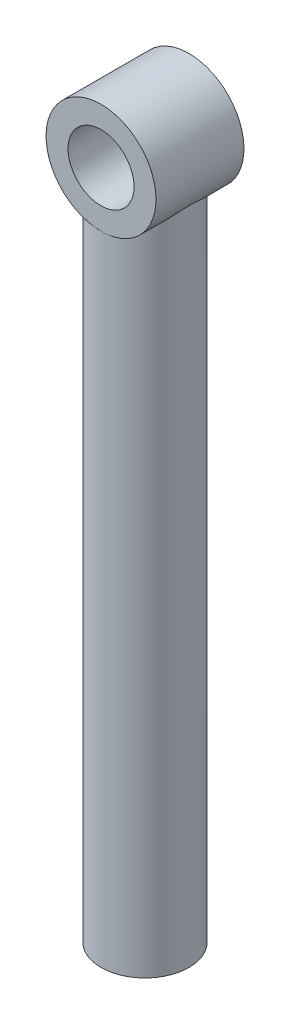
ISO-10303-21;
HEADER;
FILE_DESCRIPTION(('STEP AP214'),'2;1');
FILE_NAME('part.step','',(''),(''),'','','');
FILE_SCHEMA(('AUTOMOTIVE_DESIGN { 1 0 10303 214 1 1 1 1 }'));
ENDSEC;
DATA;
#1=APPLICATION_CONTEXT('core data for automotive mechanical design processes');
#2=APPLICATION_PROTOCOL_DEFINITION('international standard','automotive_design',2000,#1);
#3=PRODUCT_CONTEXT('',#1,'mechanical');
#4=PRODUCT('Part','Part','',(#3));
#5=PRODUCT_RELATED_PRODUCT_CATEGORY('part','',(#4));
#6=PRODUCT_DEFINITION_FORMATION('','',#4);
#7=PRODUCT_DEFINITION_CONTEXT('part definition',#1,'design');
#8=PRODUCT_DEFINITION('design','',#6,#7);
#9=PRODUCT_DEFINITION_SHAPE('','',#8);
#10=(LENGTH_UNIT() NAMED_UNIT(*) SI_UNIT(.MILLI.,.METRE.));
#11=(NAMED_UNIT(*) PLANE_ANGLE_UNIT() SI_UNIT($,.RADIAN.));
#12=(NAMED_UNIT(*) SI_UNIT($,.STERADIAN.) SOLID_ANGLE_UNIT());
#13=UNCERTAINTY_MEASURE_WITH_UNIT(LENGTH_MEASURE(1.E-05),#10,'distance_accuracy_value','');
#14=(GEOMETRIC_REPRESENTATION_CONTEXT(3) GLOBAL_UNCERTAINTY_ASSIGNED_CONTEXT((#13)) GLOBAL_UNIT_ASSIGNED_CONTEXT((#10,
#11,#12)) REPRESENTATION_CONTEXT('',''));
#15=CARTESIAN_POINT('',(0.,0.,0.));
#16=DIRECTION('',(0.,0.,1.));
#17=DIRECTION('',(1.,0.,0.));
#18=AXIS2_PLACEMENT_3D('',#15,#16,#17);
#19=CARTESIAN_POINT('',(0.,82.5,10.));
#20=DIRECTION('',(0.,0.,-1.));
#21=DIRECTION('',(-1.,0.,0.));
#22=AXIS2_PLACEMENT_3D('',#19,#20,#21);
#23=CYLINDRICAL_SURFACE('',#22,12.5);
#24=CARTESIAN_POINT('',(0.,82.5,10.));
#25=DIRECTION('',(0.,0.,1.));
#26=DIRECTION('',(1.,0.,0.));
#27=AXIS2_PLACEMENT_3D('',#24,#25,#26);
#28=CIRCLE('',#27,12.5);
#29=CARTESIAN_POINT('',(0.,70.,10.));
#30=VERTEX_POINT('',#29);
#31=EDGE_CURVE('E69',#30,#30,#28,.T.);
#32=ORIENTED_EDGE('',*,*,#31,.F.);
#33=CARTESIAN_POINT('',(-10.,75.,0.));
#34=CARTESIAN_POINT('',(-9.99999813174554,74.9999955448346,0.187780747230337));
#35=CARTESIAN_POINT('',(-9.99469639941468,74.9929123550896,0.375630167192678));
#36=CARTESIAN_POINT('',(-9.97361488371543,74.964928738387,0.74977845077353));
#37=CARTESIAN_POINT('',(-9.95782795537293,74.9440188895099,0.936076169296165));
#38=CARTESIAN_POINT('',(-9.91608860558737,74.8893255630799,1.30611935614103));
#39=CARTESIAN_POINT('',(-9.89010888419241,74.8555075194093,1.48985658649809));
#40=CARTESIAN_POINT('',(-9.82850531757991,74.7764654770198,1.85323389715609));
#41=CARTESIAN_POINT('',(-9.79287806515198,74.731237449033,2.03287250560135));
#42=CARTESIAN_POINT('',(-9.69856322438723,74.6135969548662,2.44905976839817));
#43=CARTESIAN_POINT('',(-9.63616560236761,74.5372024889383,2.68364407560338));
#44=CARTESIAN_POINT('',(-9.49619653302175,74.3707895844966,3.14325211160561));
#45=CARTESIAN_POINT('',(-9.41861819937163,74.2807649672385,3.36827144490963));
#46=CARTESIAN_POINT('',(-9.24917080831099,74.0905353354068,3.8090298473414));
#47=CARTESIAN_POINT('',(-9.15726984705952,73.9903077708106,4.02474679151453));
#48=CARTESIAN_POINT('',(-8.96009213317868,73.7829341218451,4.44645116857735));
#49=CARTESIAN_POINT('',(-8.85481572002276,73.6757882130998,4.65243884821709));
#50=CARTESIAN_POINT('',(-8.59098293088615,73.4175852137644,5.12769711944484));
#51=CARTESIAN_POINT('',(-8.42692660235966,73.2646607003274,5.39291431846417));
#52=CARTESIAN_POINT('',(-8.07569005248145,72.9559984260728,5.90591940723363));
#53=CARTESIAN_POINT('',(-7.8885015314482,72.800259672735,6.15370099086212));
#54=CARTESIAN_POINT('',(-7.49154289202905,72.4904979889625,6.63122112924694));
#55=CARTESIAN_POINT('',(-7.28179103055734,72.3364737809394,6.86097401524408));
#56=CARTESIAN_POINT('',(-6.83982610622422,72.0339375305049,7.30165036988734));
#57=CARTESIAN_POINT('',(-6.60762056554276,71.8854236649929,7.51258009923442));
#58=CARTESIAN_POINT('',(-6.16904712998335,71.6259778580375,7.87444837553496));
#59=CARTESIAN_POINT('',(-5.96662622555943,71.5134140433243,8.02901027176629));
#60=CARTESIAN_POINT('',(-5.54776042081898,71.2960722139417,8.32393747982197));
#61=CARTESIAN_POINT('',(-5.33131824507855,71.1912926950935,8.46430553626023));
#62=CARTESIAN_POINT('',(-4.88514036787227,70.9915213793486,8.72941347718792));
#63=CARTESIAN_POINT('',(-4.65542076649719,70.8965181012002,8.85417173195127));
#64=CARTESIAN_POINT('',(-4.1832667964826,70.7180675946602,9.08677590679387));
#65=CARTESIAN_POINT('',(-3.94083454601104,70.6346184495133,9.19462463244767));
#66=CARTESIAN_POINT('',(-3.48461242706595,70.4935468108981,9.3759056902702));
#67=CARTESIAN_POINT('',(-3.27252729249999,70.433930022052,9.4520832687277));
#68=CARTESIAN_POINT('',(-2.84126975117944,70.325164761399,9.59053959989836));
#69=CARTESIAN_POINT('',(-2.62209870379594,70.2760142952837,9.65282100057075));
#70=CARTESIAN_POINT('',(-2.17794108603408,70.1891203484548,9.76262692240739));
#71=CARTESIAN_POINT('',(-1.95295650130435,70.1513730274021,9.81015641185262));
#72=CARTESIAN_POINT('',(-1.49856703136047,70.0880335769738,9.88976707285663));
#73=CARTESIAN_POINT('',(-1.26916209339916,70.0624415927389,9.92184805995272));
#74=CARTESIAN_POINT('',(-0.806803631311859,70.0239001665059,9.97011933757303));
#75=CARTESIAN_POINT('',(-0.573840476359375,70.0109954255862,9.98625344336533));
#76=CARTESIAN_POINT('',(-0.106996020993305,69.9982770607164,10.0021547389755));
#77=CARTESIAN_POINT('',(0.126885281185552,69.9984634619483,10.0019218973101));
#78=CARTESIAN_POINT('',(0.59368399552371,70.0119230972085,9.98509338563439));
#79=CARTESIAN_POINT('',(0.826601374777565,70.0251967743565,9.96849716157916));
#80=CARTESIAN_POINT('',(1.28962624681565,70.0645326399258,9.91922720934001));
#81=CARTESIAN_POINT('',(1.51973380428293,70.0905945333869,9.8865538519749));
#82=CARTESIAN_POINT('',(1.96294379516938,70.15317162281,9.80788993838681));
#83=CARTESIAN_POINT('',(2.17628683290591,70.1890353012228,9.76272780671468));
#84=CARTESIAN_POINT('',(2.59777732201009,70.2710317026951,9.65912358423328));
#85=CARTESIAN_POINT('',(2.80592296067998,70.3171679543877,9.60067693004104));
#86=CARTESIAN_POINT('',(3.21583920520075,70.4189003687477,9.47124956996886));
#87=CARTESIAN_POINT('',(3.41761118881857,70.4744944701274,9.40027159509624));
#88=CARTESIAN_POINT('',(3.8140468030909,70.5942890396171,9.24652766649779));
#89=CARTESIAN_POINT('',(4.00870779968054,70.6584926565601,9.16375739917958));
#90=CARTESIAN_POINT('',(4.40850530882489,70.8010974672204,8.9787597293059));
#91=CARTESIAN_POINT('',(4.61285635157882,70.8802697268693,8.87542763503397));
#92=CARTESIAN_POINT('',(5.01156884695282,71.0465761831923,8.65655569939439));
#93=CARTESIAN_POINT('',(5.20592612512427,71.1337136654403,8.5410108172753));
#94=CARTESIAN_POINT('',(5.77337560681467,71.4052405320068,8.17740035644846));
#95=CARTESIAN_POINT('',(6.13097660608385,71.5997924368387,7.91229740873332));
#96=CARTESIAN_POINT('',(6.66900277320288,71.9250022500806,7.45620342967354));
#97=CARTESIAN_POINT('',(6.86344715742321,72.0503982112364,7.27751947441603));
#98=CARTESIAN_POINT('',(7.23644910749851,72.3051612467317,6.90672972329936));
#99=CARTESIAN_POINT('',(7.4150040467562,72.4345289728857,6.71462171771916));
#100=CARTESIAN_POINT('',(7.75620113666424,72.6950273129246,6.31743619548703));
#101=CARTESIAN_POINT('',(7.91882450630672,72.8261598050168,6.11234382988149));
#102=CARTESIAN_POINT('',(8.22775338609543,73.0875094219204,5.68969084081037));
#103=CARTESIAN_POINT('',(8.374060850356,73.217726654596,5.47213171519185));
#104=CARTESIAN_POINT('',(8.63673118831953,73.4619763432486,5.04611890037913));
#105=CARTESIAN_POINT('',(8.75462099390008,73.5763594049787,4.83880738570384));
#106=CARTESIAN_POINT('',(8.97639260059173,73.7994765885865,4.41382234400084));
#107=CARTESIAN_POINT('',(9.08027279933388,73.9082100634116,4.19614763551381));
#108=CARTESIAN_POINT('',(9.27315122226792,74.1167545391391,3.75066473392459));
#109=CARTESIAN_POINT('',(9.36217467919825,74.2165805315078,3.52287457172923));
#110=CARTESIAN_POINT('',(9.52452809660203,74.4037839943614,3.05682590107061));
#111=CARTESIAN_POINT('',(9.59786523449846,74.4911671520379,2.8185722406886));
#112=CARTESIAN_POINT('',(9.70791338789877,74.625261025915,2.40567017860436));
#113=CARTESIAN_POINT('',(9.74899332574207,74.6762795653088,2.23357948507534));
#114=CARTESIAN_POINT('',(9.82234872322265,74.7685743277607,1.88498463541875));
#115=CARTESIAN_POINT('',(9.85462703341554,74.809853704426,1.70848192846137));
#116=CARTESIAN_POINT('',(9.90980982358569,74.881095518452,1.35207943566578));
#117=CARTESIAN_POINT('',(9.93273130815532,74.911078477603,1.1721864394825));
#118=CARTESIAN_POINT('',(9.96882260473682,74.9585496872449,0.809770132434971));
#119=CARTESIAN_POINT('',(9.98199263114374,74.9760382124375,0.627246879489356));
#120=CARTESIAN_POINT('',(9.99832325785723,74.9977521175199,0.259870966528552));
#121=CARTESIAN_POINT('',(10.0014243781426,75.0018986811854,0.0750109172363204));
#122=CARTESIAN_POINT('',(9.99737241559767,74.9964971759901,-0.294389135441814));
#123=CARTESIAN_POINT('',(9.990219496584,74.9869493259087,-0.478929143893474));
#124=CARTESIAN_POINT('',(9.96582394992435,74.9546201466682,-0.846336867621133));
#125=CARTESIAN_POINT('',(9.94857159573964,74.9318260605118,-1.02920279796419));
#126=CARTESIAN_POINT('',(9.90434599484069,74.874041414933,-1.39188439117542));
#127=CARTESIAN_POINT('',(9.87736669608351,74.8390432626641,-1.57169808186486));
#128=CARTESIAN_POINT('',(9.80617450706731,74.7480279501891,-1.97235347476501));
#129=CARTESIAN_POINT('',(9.75932568116059,74.6889306380843,-2.19202681458675));
#130=CARTESIAN_POINT('',(9.65220089264074,74.5569385998435,-2.62384653611254));
#131=CARTESIAN_POINT('',(9.59191818069454,74.4840369410275,-2.83598907192892));
#132=CARTESIAN_POINT('',(9.45874798324519,74.327321401197,-3.25269871738509));
#133=CARTESIAN_POINT('',(9.38583110524633,74.2434821896857,-3.45724678070972));
#134=CARTESIAN_POINT('',(9.2282748605154,74.0677473612281,-3.85815198467595));
#135=CARTESIAN_POINT('',(9.14363496618432,73.975851381752,-4.05450875614738));
#136=CARTESIAN_POINT('',(8.9218864151902,73.7429310527192,-4.52724087374258));
#137=CARTESIAN_POINT('',(8.77849706058981,73.5986762130779,-4.79909370936659));
#138=CARTESIAN_POINT('',(8.46914630027284,73.3038433369787,-5.32606300727596));
#139=CARTESIAN_POINT('',(8.30317562618969,73.1532627217788,-5.58117253330163));
#140=CARTESIAN_POINT('',(7.94909566082844,72.8503250357967,-6.07488503601567));
#141=CARTESIAN_POINT('',(7.76096469969186,72.697966359651,-6.31347148725069));
#142=CARTESIAN_POINT('',(7.36300941651491,72.3956174150051,-6.77336949672277));
#143=CARTESIAN_POINT('',(7.15318849152331,72.2456267798548,-6.99468375060491));
#144=CARTESIAN_POINT('',(6.708831318802,71.9494598252269,-7.42212677142695));
#145=CARTESIAN_POINT('',(6.47398376813524,71.8033690602807,-7.62799223170155));
#146=CARTESIAN_POINT('',(5.98235744974253,71.5208480595731,-8.01935781412402));
#147=CARTESIAN_POINT('',(5.7255752609262,71.3844193368678,-8.20485474909514));
#148=CARTESIAN_POINT('',(5.19149185691712,71.1251905783332,-8.5527598284787));
#149=CARTESIAN_POINT('',(4.91424896153542,71.0023541243826,-8.71523001450627));
#150=CARTESIAN_POINT('',(4.33994522794858,70.7735228555021,-9.01496710945892));
#151=CARTESIAN_POINT('',(4.04289574127698,70.6675185095911,-9.15224828825933));
#152=CARTESIAN_POINT('',(3.529856382133,70.5067800602605,-9.35895618246774));
#153=CARTESIAN_POINT('',(3.31861921316358,70.4465363293164,-9.43598796918124));
#154=CARTESIAN_POINT('',(2.88900338783717,70.3364155090094,-9.57625602415171));
#155=CARTESIAN_POINT('',(2.67062660821157,70.2865357203181,-9.63949588478217));
#156=CARTESIAN_POINT('',(2.22802047680871,70.1980965123713,-9.75130752210639));
#157=CARTESIAN_POINT('',(2.00379429256989,70.1595310993066,-9.79988706551939));
#158=CARTESIAN_POINT('',(1.55081106777726,70.094463551713,-9.8816977469845));
#159=CARTESIAN_POINT('',(1.32205386645509,70.0679618460284,-9.91492833940808));
#160=CARTESIAN_POINT('',(0.860825342765614,70.0275197074723,-9.96559074485294));
#161=CARTESIAN_POINT('',(0.628343431234386,70.0136259792322,-9.98296381710745));
#162=CARTESIAN_POINT('',(0.162318500323262,69.9988800745952,-10.0014014144932));
#163=CARTESIAN_POINT('',(-0.0712245148403139,69.9980278464228,-10.0024660043699));
#164=CARTESIAN_POINT('',(-0.537506278398429,70.0093843158666,-9.98826801977646));
#165=CARTESIAN_POINT('',(-0.770244974331355,70.0215938498857,-9.973004399738));
#166=CARTESIAN_POINT('',(-1.23306514381097,70.0588004435502,-9.92641138491754));
#167=CARTESIAN_POINT('',(-1.46314667542052,70.0837972232332,-9.89508234186992));
#168=CARTESIAN_POINT('',(-1.90667734682165,70.1443550950667,-9.81898470319925));
#169=CARTESIAN_POINT('',(-2.1203551883125,70.1792752084621,-9.77503017427004));
#170=CARTESIAN_POINT('',(-2.54262133008555,70.2594412339473,-9.67379112667855));
#171=CARTESIAN_POINT('',(-2.75120784846495,70.3046907054184,-9.61650201293344));
#172=CARTESIAN_POINT('',(-3.16209582786697,70.4047177078339,-9.48933059481018));
#173=CARTESIAN_POINT('',(-3.36439860638106,70.4594932253713,-9.41945095143026));
#174=CARTESIAN_POINT('',(-3.76196760821216,70.5777251207595,-9.26784164513736));
#175=CARTESIAN_POINT('',(-3.95723121896518,70.6411846805962,-9.1861076379167));
#176=CARTESIAN_POINT('',(-4.35772248527332,70.7820917429015,-9.0035026511274));
#177=CARTESIAN_POINT('',(-4.56219805706188,70.8602904138105,-8.9015603739747));
#178=CARTESIAN_POINT('',(-4.96126950156085,71.0247022160864,-8.68546796230572));
#179=CARTESIAN_POINT('',(-5.15586125091693,71.1109186505438,-8.57131279348599));
#180=CARTESIAN_POINT('',(-5.72415055477491,71.3797737160793,-8.21187648745799));
#181=CARTESIAN_POINT('',(-6.08250606818362,71.5726701691664,-7.94955799077468));
#182=CARTESIAN_POINT('',(-6.62176971629551,71.8953680287716,-7.49814790172896));
#183=CARTESIAN_POINT('',(-6.81661101064407,72.0197878750915,-7.32137108315486));
#184=CARTESIAN_POINT('',(-7.1905592776784,72.2727453438277,-6.9544539542442));
#185=CARTESIAN_POINT('',(-7.36966370989654,72.4012836265466,-6.76431149512181));
#186=CARTESIAN_POINT('',(-7.71211858804315,72.6603151628115,-6.37113074679202));
#187=CARTESIAN_POINT('',(-7.87545018712458,72.7908105450386,-6.16807749929003));
#188=CARTESIAN_POINT('',(-8.18596309891628,73.0511362327005,-5.7495985853367));
#189=CARTESIAN_POINT('',(-8.33314619770876,73.1809666101699,-5.53417429119085));
#190=CARTESIAN_POINT('',(-8.59982698833525,73.4267890630154,-5.10889225542908));
#191=CARTESIAN_POINT('',(-8.7206007351081,73.5430516948893,-4.89999101053443));
#192=CARTESIAN_POINT('',(-8.94783728556881,73.7700520843053,-4.47157758353124));
#193=CARTESIAN_POINT('',(-9.05429817542914,73.8807891017537,-4.25206398772896));
#194=CARTESIAN_POINT('',(-9.25206042611902,74.0934294243888,-3.80257659068593));
#195=CARTESIAN_POINT('',(-9.34338255268977,74.195344736939,-3.57261767855442));
#196=CARTESIAN_POINT('',(-9.51000021733221,74.3866785870653,-3.10195782761453));
#197=CARTESIAN_POINT('',(-9.58530381357833,74.4761034002166,-2.86126236393569));
#198=CARTESIAN_POINT('',(-9.69882423002064,74.6140457687138,-2.44232926771817));
#199=CARTESIAN_POINT('',(-9.7414220017882,74.6668385399672,-2.26668149596891));
#200=CARTESIAN_POINT('',(-9.81744220174494,74.7623287567473,-1.91073769348356));
#201=CARTESIAN_POINT('',(-9.85086784864239,74.8050297429804,-1.73044331770591));
#202=CARTESIAN_POINT('',(-9.90790155745935,74.878605429671,-1.36649579591928));
#203=CARTESIAN_POINT('',(-9.93153931177947,74.9095158749067,-1.18285459904665));
#204=CARTESIAN_POINT('',(-9.96863570581848,74.9582987473073,-0.812899477332312));
#205=CARTESIAN_POINT('',(-9.98210147289064,74.9761803033002,-0.626587517299083));
#206=CARTESIAN_POINT('',(-9.99354886913079,74.9914049359932,-0.366545755990401));
#207=CARTESIAN_POINT('',(-9.99596653839238,74.9946245549252,-0.293303173951866));
#208=CARTESIAN_POINT('',(-9.99919257352988,74.9989230965412,-0.146710563474031));
#209=CARTESIAN_POINT('',(-10.0000007298731,75.0000017405046,-0.0733605222889955));
#210=CARTESIAN_POINT('',(-10.,75.,0.));
#211=B_SPLINE_CURVE_WITH_KNOTS('',3,(#33,#34,#35,#36,#37,#38,#39,#40,#41,#42,#43,#44,#45,#46,
#47,#48,#49,#50,#51,#52,#53,#54,#55,#56,#57,#58,#59,#60,#61,#62,#63,#64,#65,#66,#67,#68,#69,#70,
#71,#72,#73,#74,#75,#76,#77,#78,#79,#80,#81,#82,#83,#84,#85,#86,#87,#88,#89,#90,#91,#92,#93,#94,
#95,#96,#97,#98,#99,#100,#101,#102,#103,#104,#105,#106,#107,#108,#109,#110,#111,#112,#113,#114,
#115,#116,#117,#118,#119,#120,#121,#122,#123,#124,#125,#126,#127,#128,#129,#130,#131,#132,#133,
#134,#135,#136,#137,#138,#139,#140,#141,#142,#143,#144,#145,#146,#147,#148,#149,#150,#151,#152,
#153,#154,#155,#156,#157,#158,#159,#160,#161,#162,#163,#164,#165,#166,#167,#168,#169,#170,#171,
#172,#173,#174,#175,#176,#177,#178,#179,#180,#181,#182,#183,#184,#185,#186,#187,#188,#189,#190,
#191,#192,#193,#194,#195,#196,#197,#198,#199,#200,#201,#202,#203,#204,#205,#206,#207,#208,#209,
#210),.UNSPECIFIED.,.T.,.F.,(4,2,2,2,2,2,2,2,2,2,2,2,2,2,2,2,2,2,2,2,2,2,2,2,2,2,2,2,2,2,2,2,2,
2,2,2,2,2,2,2,2,2,2,2,2,2,2,2,2,2,2,2,2,2,2,2,2,2,2,2,2,2,2,2,2,2,2,2,2,2,2,2,2,2,2,2,2,2,2,2,2,
2,2,2,2,2,2,2,4),(0.,0.563257874708413,1.12689996709567,1.69206211543075,2.25742412251104,
3.01964897941705,3.78222040415065,4.54651540684074,5.31079101534043,6.3514524531641,
7.39248836362745,8.4326881770935,9.47254071387705,10.3071414574999,11.1415805073962,
11.9750281284068,12.8083373198068,13.50694467583,14.2054187961747,14.9036574222391,
15.6019043854079,16.3026027649874,17.0033024924223,17.7040259455392,18.4047332372389,
19.0670200980616,19.729534806626,20.3919053081943,21.0545187283911,21.7806721273111,
22.5071264205978,23.9595810174839,24.8359771251551,25.712517837003,26.5900797332695,
27.4675364130523,28.2604551740127,29.0534645494224,29.8451130573291,30.6363985604421,
31.1883536087862,31.7401296842847,32.2908984787776,32.8416551637374,33.3956594686796,
33.9496549230514,34.5041847977951,35.0590602946132,35.7547485424486,36.45078710293,
37.1484672399164,37.8461787864838,38.8633194407996,39.8808788409229,40.8994416730173,
41.9178452203688,42.9508544099799,43.9840250106464,45.0143567206867,46.0441029210092,
46.7417613199329,47.4392377826457,48.1363440860905,48.8334751685459,49.5331782649317,
50.2328785834582,50.9326237096035,51.6323535162697,52.2944237604281,52.9567224919029,
53.6188814109241,54.2812836095483,55.0050347613717,55.7290854102384,57.1766904185346,
58.0491452657777,58.921740699278,59.7953662138777,60.6688950047384,61.471847254201,
62.2749067629604,63.0768554384186,63.8783997318869,64.4428010844124,65.0070041215714,
65.5694828352509,66.1315670623317,66.3515870282688,66.5716356353889),.UNSPECIFIED.);
#212=CARTESIAN_POINT('',(0.,70.,-10.));
#213=VERTEX_POINT('',#212);
#214=EDGE_CURVE('E65',#30,#213,#211,.T.);
#215=ORIENTED_EDGE('',*,*,#214,.T.);
#216=CARTESIAN_POINT('',(0.,82.5,-10.));
#217=DIRECTION('',(0.,0.,1.));
#218=DIRECTION('',(1.,0.,0.));
#219=AXIS2_PLACEMENT_3D('',#216,#217,#218);
#220=CIRCLE('',#219,12.5);
#221=EDGE_CURVE('E67',#213,#213,#220,.T.);
#222=ORIENTED_EDGE('',*,*,#221,.T.);
#223=EDGE_CURVE('E62',#213,#30,#211,.T.);
#224=ORIENTED_EDGE('',*,*,#223,.T.);
#225=EDGE_LOOP('',(#32,#215,#222,#224));
#226=FACE_BOUND('',#225,.T.);
#227=ADVANCED_FACE('F39',(#226),#23,.T.);
#228=CARTESIAN_POINT('',(0.,82.5,10.));
#229=DIRECTION('',(0.,0.,1.));
#230=DIRECTION('',(1.,0.,0.));
#231=AXIS2_PLACEMENT_3D('',#228,#229,#230);
#232=PLANE('',#231);
#233=ORIENTED_EDGE('',*,*,#31,.T.);
#234=EDGE_LOOP('',(#233));
#235=FACE_BOUND('',#234,.T.);
#236=CARTESIAN_POINT('',(0.,82.5,10.));
#237=DIRECTION('',(0.,0.,1.));
#238=DIRECTION('',(1.,0.,0.));
#239=AXIS2_PLACEMENT_3D('',#236,#237,#238);
#240=CIRCLE('',#239,7.5);
#241=CARTESIAN_POINT('',(7.5,82.5,10.));
#242=VERTEX_POINT('',#241);
#243=EDGE_CURVE('E123',#242,#242,#240,.T.);
#244=ORIENTED_EDGE('',*,*,#243,.F.);
#245=EDGE_LOOP('',(#244));
#246=FACE_BOUND('',#245,.T.);
#247=ADVANCED_FACE('F102',(#235,#246),#232,.T.);
#248=CARTESIAN_POINT('',(0.,82.5,-10.));
#249=DIRECTION('',(0.,0.,1.));
#250=DIRECTION('',(1.,0.,0.));
#251=AXIS2_PLACEMENT_3D('',#248,#249,#250);
#252=PLANE('',#251);
#253=ORIENTED_EDGE('',*,*,#221,.F.);
#254=EDGE_LOOP('',(#253));
#255=FACE_BOUND('',#254,.T.);
#256=CARTESIAN_POINT('',(0.,82.5,-10.));
#257=DIRECTION('',(0.,0.,1.));
#258=DIRECTION('',(1.,0.,0.));
#259=AXIS2_PLACEMENT_3D('',#256,#257,#258);
#260=CIRCLE('',#259,7.5);
#261=CARTESIAN_POINT('',(7.5,82.5,-10.));
#262=VERTEX_POINT('',#261);
#263=EDGE_CURVE('E126',#262,#262,#260,.T.);
#264=ORIENTED_EDGE('',*,*,#263,.T.);
#265=EDGE_LOOP('',(#264));
#266=FACE_BOUND('',#265,.T.);
#267=ADVANCED_FACE('F88',(#255,#266),#252,.F.);
#268=CARTESIAN_POINT('',(0.,82.5,10.));
#269=DIRECTION('',(0.,0.,-1.));
#270=DIRECTION('',(-1.,0.,0.));
#271=AXIS2_PLACEMENT_3D('',#268,#269,#270);
#272=CYLINDRICAL_SURFACE('',#271,7.5);
#273=ORIENTED_EDGE('',*,*,#243,.T.);
#274=EDGE_LOOP('',(#273));
#275=FACE_BOUND('',#274,.T.);
#276=ORIENTED_EDGE('',*,*,#263,.F.);
#277=EDGE_LOOP('',(#276));
#278=FACE_BOUND('',#277,.T.);
#279=ADVANCED_FACE('F110',(#275,#278),#272,.F.);
#280=CARTESIAN_POINT('',(0.,75.,0.));
#281=DIRECTION('',(0.,-1.,0.));
#282=DIRECTION('',(0.,0.,-1.));
#283=AXIS2_PLACEMENT_3D('',#280,#281,#282);
#284=CYLINDRICAL_SURFACE('',#283,10.);
#285=CARTESIAN_POINT('',(0.,-75.,0.));
#286=DIRECTION('',(0.,1.,0.));
#287=DIRECTION('',(0.,0.,1.));
#288=AXIS2_PLACEMENT_3D('',#285,#286,#287);
#289=CIRCLE('',#288,10.);
#290=CARTESIAN_POINT('',(0.,-75.,10.));
#291=VERTEX_POINT('',#290);
#292=EDGE_CURVE('E11',#291,#291,#289,.T.);
#293=ORIENTED_EDGE('',*,*,#292,.T.);
#294=EDGE_LOOP('',(#293));
#295=FACE_BOUND('',#294,.T.);
#296=ORIENTED_EDGE('',*,*,#214,.F.);
#297=ORIENTED_EDGE('',*,*,#223,.F.);
#298=EDGE_LOOP('',(#296,#297));
#299=FACE_BOUND('',#298,.T.);
#300=ADVANCED_FACE('F41',(#295,#299),#284,.T.);
#301=CARTESIAN_POINT('',(0.,75.,0.));
#302=DIRECTION('',(0.,-1.,0.));
#303=DIRECTION('',(0.,0.,-1.));
#304=AXIS2_PLACEMENT_3D('',#301,#302,#303);
#305=CYLINDRICAL_SURFACE('',#304,5.);
#306=CARTESIAN_POINT('',(0.,-75.,0.));
#307=DIRECTION('',(0.,1.,0.));
#308=DIRECTION('',(0.,0.,1.));
#309=AXIS2_PLACEMENT_3D('',#306,#307,#308);
#310=CIRCLE('',#309,5.);
#311=CARTESIAN_POINT('',(0.,-75.,5.));
#312=VERTEX_POINT('',#311);
#313=EDGE_CURVE('E55',#312,#312,#310,.T.);
#314=ORIENTED_EDGE('',*,*,#313,.F.);
#315=EDGE_LOOP('',(#314));
#316=FACE_BOUND('',#315,.T.);
#317=CARTESIAN_POINT('',(0.,70.,-5.));
#318=CARTESIAN_POINT('',(-0.134428040880246,70.0000006012853,-4.99999922743341));
#319=CARTESIAN_POINT('',(-0.268907963042154,70.0021745569546,-4.99457122690615));
#320=CARTESIAN_POINT('',(-0.536916320402138,70.0108158731189,-4.97290825611696));
#321=CARTESIAN_POINT('',(-0.670444059868571,70.017286101132,-4.95666606797847));
#322=CARTESIAN_POINT('',(-0.935792063184507,70.0343671477423,-4.91349125525673));
#323=CARTESIAN_POINT('',(-1.06760803727625,70.04498684132,-4.88653571455054));
#324=CARTESIAN_POINT('',(-1.32834211367395,70.0700895525597,-4.82219349586899));
#325=CARTESIAN_POINT('',(-1.45725900847257,70.0845741488366,-4.78480255527993));
#326=CARTESIAN_POINT('',(-1.71081101883519,70.1169716133721,-4.70009768671192));
#327=CARTESIAN_POINT('',(-1.83546024588383,70.1348715628335,-4.65282108922938));
#328=CARTESIAN_POINT('',(-2.08021423561347,70.1736826840139,-4.54867299458791));
#329=CARTESIAN_POINT('',(-2.20031728026545,70.1945949800494,-4.49179791356251));
#330=CARTESIAN_POINT('',(-2.5525365078776,70.2610690240393,-4.30750693661382));
#331=CARTESIAN_POINT('',(-2.77691477785268,70.3104150509956,-4.16630678643484));
#332=CARTESIAN_POINT('',(-3.20878788906516,70.4167304661701,-3.8444050755273));
#333=CARTESIAN_POINT('',(-3.41514420143944,70.4739361998055,-3.66226779941344));
#334=CARTESIAN_POINT('',(-3.795448997497,70.5884919574201,-3.26646553449653));
#335=CARTESIAN_POINT('',(-3.96938162582803,70.6458420381658,-3.05278521201505));
#336=CARTESIAN_POINT('',(-4.20603567526882,70.7285643149833,-2.70739394208527));
#337=CARTESIAN_POINT('',(-4.28222203675302,70.7561377954228,-2.58522008490604));
#338=CARTESIAN_POINT('',(-4.42396507270082,70.8087964691502,-2.33436384458271));
#339=CARTESIAN_POINT('',(-4.4895261186149,70.8338826840872,-2.20568416678666));
#340=CARTESIAN_POINT('',(-4.60945924526238,70.8807471149194,-1.94262456692823));
#341=CARTESIAN_POINT('',(-4.66383056922586,70.9025251070507,-1.80824426006852));
#342=CARTESIAN_POINT('',(-4.76082403397005,70.9420028482277,-1.53479113042289));
#343=CARTESIAN_POINT('',(-4.80345206019441,70.9597046394294,-1.39572069758004));
#344=CARTESIAN_POINT('',(-4.87487504470653,70.9896991100237,-1.12023380302831));
#345=CARTESIAN_POINT('',(-4.90420529162586,71.0021990182783,-0.983978665748058));
#346=CARTESIAN_POINT('',(-4.95140857029289,71.0224473302589,-0.709206324517051));
#347=CARTESIAN_POINT('',(-4.9692867763062,71.0301978797732,-0.570690171191073));
#348=CARTESIAN_POINT('',(-4.99338985465939,71.0406705547614,-0.292486721195766));
#349=CARTESIAN_POINT('',(-4.99961718879243,71.0433937424997,-0.152799678199003));
#350=CARTESIAN_POINT('',(-5.00034850975979,71.0437128122695,0.126607542473486));
#351=CARTESIAN_POINT('',(-4.99485304337848,71.0413089334418,0.266327718299869));
#352=CARTESIAN_POINT('',(-4.97300139062978,71.0318099115967,0.534904247198445));
#353=CARTESIAN_POINT('',(-4.95743098313014,71.0250543311401,0.663837483450298));
#354=CARTESIAN_POINT('',(-4.91636669802671,71.0074007553178,0.919866830647772));
#355=CARTESIAN_POINT('',(-4.89086955440044,70.9965013966241,1.04696232266372));
#356=CARTESIAN_POINT('',(-4.83020381694143,70.9708970892292,1.29840172426553));
#357=CARTESIAN_POINT('',(-4.79503755159834,70.9561930568085,1.42274628854221));
#358=CARTESIAN_POINT('',(-4.71535272789896,70.9234160137993,1.66796184240903));
#359=CARTESIAN_POINT('',(-4.67083057532248,70.9053417087657,1.78883147670131));
#360=CARTESIAN_POINT('',(-4.52178156820716,70.8460250704841,2.14989977022601));
#361=CARTESIAN_POINT('',(-4.40296429143379,70.8002191467559,2.38363297149718));
#362=CARTESIAN_POINT('',(-4.13125151068097,70.7015434601125,2.82857968213379));
#363=CARTESIAN_POINT('',(-3.97834320762597,70.648671047161,3.03978468940818));
#364=CARTESIAN_POINT('',(-3.62889137093417,70.5368340769261,3.45100744508915));
#365=CARTESIAN_POINT('',(-3.42988845371517,70.4777145302711,3.64889829383636));
#366=CARTESIAN_POINT('',(-3.0007412633752,70.3634982201437,4.00923472946474));
#367=CARTESIAN_POINT('',(-2.77059080292405,70.3084022592964,4.17167325709669));
#368=CARTESIAN_POINT('',(-2.40397180160013,70.2326846496495,4.3865249596523));
#369=CARTESIAN_POINT('',(-2.2767950068552,70.2083897719015,4.45387262706835));
#370=CARTESIAN_POINT('',(-2.01664956005585,70.1630427954415,4.5775355563751));
#371=CARTESIAN_POINT('',(-1.88368330291786,70.1419893718882,4.63385532813925));
#372=CARTESIAN_POINT('',(-1.61291597890483,70.1037424407442,4.73491158455454));
#373=CARTESIAN_POINT('',(-1.47511586065891,70.0865481806516,4.77965032766275));
#374=CARTESIAN_POINT('',(-1.19570710246716,70.0565271362531,4.85708691585543));
#375=CARTESIAN_POINT('',(-1.05409872694101,70.0437000495605,4.8897855946164));
#376=CARTESIAN_POINT('',(-0.776729176174349,70.0234272518458,4.94119316354648));
#377=CARTESIAN_POINT('',(-0.641120300634818,70.0157071533962,4.96061765425684));
#378=CARTESIAN_POINT('',(-0.36853635313639,70.0046892980839,4.98828145278476));
#379=CARTESIAN_POINT('',(-0.231560830747306,70.0013930512705,4.9965169413305));
#380=CARTESIAN_POINT('',(0.0425534985314604,69.9993214342559,5.00169671083353));
#381=CARTESIAN_POINT('',(0.179692155300515,70.0005433137226,4.99864786093766));
#382=CARTESIAN_POINT('',(0.453193646078512,70.0074688588887,4.98130482254118));
#383=CARTESIAN_POINT('',(0.589556177098901,70.0131741681682,4.96700651009899));
#384=CARTESIAN_POINT('',(0.8542487094487,70.0285513532469,4.92821788603312));
#385=CARTESIAN_POINT('',(0.982662386499643,70.0380314532565,4.90421959347198));
#386=CARTESIAN_POINT('',(1.236951486414,70.0606972085282,4.84633496813353));
#387=CARTESIAN_POINT('',(1.36282600376893,70.0738841615278,4.81244517226563));
#388=CARTESIAN_POINT('',(1.61115102742897,70.103636900411,4.73509171553989));
#389=CARTESIAN_POINT('',(1.73360251217363,70.1202017093031,4.69163082268065));
#390=CARTESIAN_POINT('',(1.97439656120156,70.1563126363862,4.59549698364839));
#391=CARTESIAN_POINT('',(2.0927375418746,70.175859888289,4.54282053325719));
#392=CARTESIAN_POINT('',(2.44755555665468,70.2395693745111,4.3680927445861));
#393=CARTESIAN_POINT('',(2.67640599367795,70.2878750379616,4.23165397920141));
#394=CARTESIAN_POINT('',(3.10864805700672,70.3906704457365,3.92513152383826));
#395=CARTESIAN_POINT('',(3.31202942740562,70.4451626645361,3.75503435094411));
#396=CARTESIAN_POINT('',(3.70179180327649,70.558869402211,3.37284153545527));
#397=CARTESIAN_POINT('',(3.88616393977712,70.6181581731733,3.15871452909377));
#398=CARTESIAN_POINT('',(4.2168988917129,70.7314639692257,2.70135140165044));
#399=CARTESIAN_POINT('',(4.36325544343981,70.7854801246495,2.45811049319526));
#400=CARTESIAN_POINT('',(4.55142555782971,70.8578744126486,2.07488132968347));
#401=CARTESIAN_POINT('',(4.60914530472445,70.8806662028584,1.94332027063967));
#402=CARTESIAN_POINT('',(4.71320516045849,70.9224852654326,1.67521283440413));
#403=CARTESIAN_POINT('',(4.7595502120223,70.9415141722077,1.53866865229769));
#404=CARTESIAN_POINT('',(4.84036067147021,70.9751214493691,1.26163687137965));
#405=CARTESIAN_POINT('',(4.87483074938323,70.9897015690559,1.12115084632278));
#406=CARTESIAN_POINT('',(4.93151664575948,71.0138736921044,0.837305374046754));
#407=CARTESIAN_POINT('',(4.95373349010207,71.0234661130482,0.693946168421152));
#408=CARTESIAN_POINT('',(4.9844819536379,71.036789427669,0.416001035427217));
#409=CARTESIAN_POINT('',(4.9938856568838,71.0408934445137,0.281528785252226));
#410=CARTESIAN_POINT('',(5.00180093636109,71.0443460388006,0.012153918079308));
#411=CARTESIAN_POINT('',(5.00030885599691,71.0436930197946,-0.122748828208797));
#412=CARTESIAN_POINT('',(4.98644346125971,71.0376513007191,-0.391817161394217));
#413=CARTESIAN_POINT('',(4.97407559907525,71.0322649735272,-0.525983083765133));
#414=CARTESIAN_POINT('',(4.93860056102212,71.0169430716944,-0.792672045274384));
#415=CARTESIAN_POINT('',(4.91548933784265,71.0070057826056,-0.925194445920414));
#416=CARTESIAN_POINT('',(4.85990688487219,70.9833955597823,-1.18232966966298));
#417=CARTESIAN_POINT('',(4.82784722608916,70.9698880294204,-1.30704679367843));
#418=CARTESIAN_POINT('',(4.75435551317661,70.9393910926841,-1.55326624509704));
#419=CARTESIAN_POINT('',(4.71292020385952,70.9224004771899,-1.67476743953828));
#420=CARTESIAN_POINT('',(4.57505004689656,70.8669098320993,-2.03331443463416));
#421=CARTESIAN_POINT('',(4.46501084942241,70.8238730473093,-2.26458726584229));
#422=CARTESIAN_POINT('',(4.20467910946436,70.7275336207367,-2.71905640171311));
#423=CARTESIAN_POINT('',(4.052442544111,70.6737842797996,-2.94103209010337));
#424=CARTESIAN_POINT('',(3.71470108315128,70.5633985511505,-3.35749788263443));
#425=CARTESIAN_POINT('',(3.52918616017587,70.5067612969501,-3.55197967069736));
#426=CARTESIAN_POINT('',(3.22271513320782,70.4220707256674,-3.82551348036494));
#427=CARTESIAN_POINT('',(3.11206947531873,70.3930208175849,-3.91605646798892));
#428=CARTESIAN_POINT('',(2.88318647887271,70.3364846250137,-4.08749937066961));
#429=CARTESIAN_POINT('',(2.76495189987678,70.3089977789287,-4.16840276074986));
#430=CARTESIAN_POINT('',(2.52148785822199,70.2563228754268,-4.32003376872982));
#431=CARTESIAN_POINT('',(2.3962519442802,70.231136996414,-4.39075177955365));
#432=CARTESIAN_POINT('',(2.13974317443307,70.1838116859151,-4.52130456518992));
#433=CARTESIAN_POINT('',(2.00847311867465,70.161670860037,-4.58114432544264));
#434=CARTESIAN_POINT('',(1.7431850308944,70.1214307269439,-4.68843322432491));
#435=CARTESIAN_POINT('',(1.60925996819087,70.1032654244232,-4.73608733639103));
#436=CARTESIAN_POINT('',(1.33744351766941,70.0710031950851,-4.81990233369499));
#437=CARTESIAN_POINT('',(1.19955402639713,70.0569043573831,-4.85606861802443));
#438=CARTESIAN_POINT('',(0.92117899439903,70.0332082152908,-4.91646900376361));
#439=CARTESIAN_POINT('',(0.780700905910179,70.0235996100943,-4.94073306786011));
#440=CARTESIAN_POINT('',(0.498015171774933,70.0091241021857,-4.97717423269897));
#441=CARTESIAN_POINT('',(0.355808918388266,70.0042536094657,-4.98936048477889));
#442=CARTESIAN_POINT('',(0.177825352118351,70.0012142127485,-4.99696366073591));
#443=CARTESIAN_POINT('',(0.142272352477997,70.0007590813378,-4.99810203420122));
#444=CARTESIAN_POINT('',(0.0711474464104165,70.0001518954709,-4.99962030588418));
#445=CARTESIAN_POINT('',(0.0355755399919987,69.9999998408736,-5.00000020445491));
#446=CARTESIAN_POINT('',(0.,70.,-5.));
#447=B_SPLINE_CURVE_WITH_KNOTS('',3,(#317,#318,#319,#320,#321,#322,#323,#324,#325,#326,#327,
#328,#329,#330,#331,#332,#333,#334,#335,#336,#337,#338,#339,#340,#341,#342,#343,#344,#345,#346,
#347,#348,#349,#350,#351,#352,#353,#354,#355,#356,#357,#358,#359,#360,#361,#362,#363,#364,#365,
#366,#367,#368,#369,#370,#371,#372,#373,#374,#375,#376,#377,#378,#379,#380,#381,#382,#383,#384,
#385,#386,#387,#388,#389,#390,#391,#392,#393,#394,#395,#396,#397,#398,#399,#400,#401,#402,#403,
#404,#405,#406,#407,#408,#409,#410,#411,#412,#413,#414,#415,#416,#417,#418,#419,#420,#421,#422,
#423,#424,#425,#426,#427,#428,#429,#430,#431,#432,#433,#434,#435,#436,#437,#438,#439,#440,#441,
#442,#443,#444,#445,#446),.UNSPECIFIED.,.T.,.F.,(4,2,2,2,2,2,2,2,2,2,2,2,2,2,2,2,2,2,2,2,2,2,2,
2,2,2,2,2,2,2,2,2,2,2,2,2,2,2,2,2,2,2,2,2,2,2,2,2,2,2,2,2,2,2,2,2,2,2,2,2,2,2,2,2,4),(0.,
0.403247545127348,0.806764506023344,1.21114928538012,1.61569948871384,2.01874874890204,
2.42194883328358,3.22723902880423,4.06710473211456,4.90738006296491,5.34671991454218,
5.78587855222681,6.22506688081049,6.66403469721493,7.08328748777367,7.50235071750984,
7.92132539047816,8.34028052171746,8.72995920476621,9.11976620555498,9.50947941625393,
9.89934261638529,10.6941760924545,11.4893084834387,12.345906664648,13.2026752559774,
13.6400384630793,14.0772224346053,14.5143210850114,14.9513894641977,15.3624968549506,
15.7737445385294,16.1847419233425,16.5958900459693,16.9883780843378,17.3810037009245,
17.7735159174186,18.1661777124847,18.9747143225963,19.783575475114,20.6458383532501,
21.5082432137335,21.9441519877961,22.379871006724,22.815418475839,23.2509294740085,
23.655003908265,24.0592139550411,24.4632214808537,24.8673813305822,25.2553678352619,
25.6434892545336,26.4191721859434,27.2392679922317,28.0596113245242,28.4968494117638,
28.9339293970247,29.3714189832268,29.8087075621829,30.2380680730947,30.667226491969,
31.0952989296225,31.5230467689857,31.6297637586308,31.7364806985967),.UNSPECIFIED.);
#448=CARTESIAN_POINT('',(0.,70.,-5.));
#449=VERTEX_POINT('',#448);
#450=EDGE_CURVE('E44',#449,#449,#447,.T.);
#451=ORIENTED_EDGE('',*,*,#450,.T.);
#452=EDGE_LOOP('',(#451));
#453=FACE_BOUND('',#452,.T.);
#454=ADVANCED_FACE('F90',(#316,#453),#305,.F.);
#455=CARTESIAN_POINT('',(0.,-75.,0.));
#456=DIRECTION('',(0.,1.,0.));
#457=DIRECTION('',(0.,0.,1.));
#458=AXIS2_PLACEMENT_3D('',#455,#456,#457);
#459=PLANE('',#458);
#460=ORIENTED_EDGE('',*,*,#292,.F.);
#461=EDGE_LOOP('',(#460));
#462=FACE_BOUND('',#461,.T.);
#463=ORIENTED_EDGE('',*,*,#313,.T.);
#464=EDGE_LOOP('',(#463));
#465=FACE_BOUND('',#464,.T.);
#466=ADVANCED_FACE('F86',(#462,#465),#459,.F.);
#467=ORIENTED_EDGE('',*,*,#450,.F.);
#468=EDGE_LOOP('',(#467));
#469=FACE_BOUND('',#468,.T.);
#470=ADVANCED_FACE('F82',(#469),#23,.T.);
#471=CLOSED_SHELL('',(#227,#247,#267,#279,#300,#454,#466,#470));
#472=MANIFOLD_SOLID_BREP('B2',#471);
#473=ADVANCED_BREP_SHAPE_REPRESENTATION('',(#18,#472),#14);
#474=SHAPE_DEFINITION_REPRESENTATION(#9,#473);
ENDSEC;
END-ISO-10303-21;
